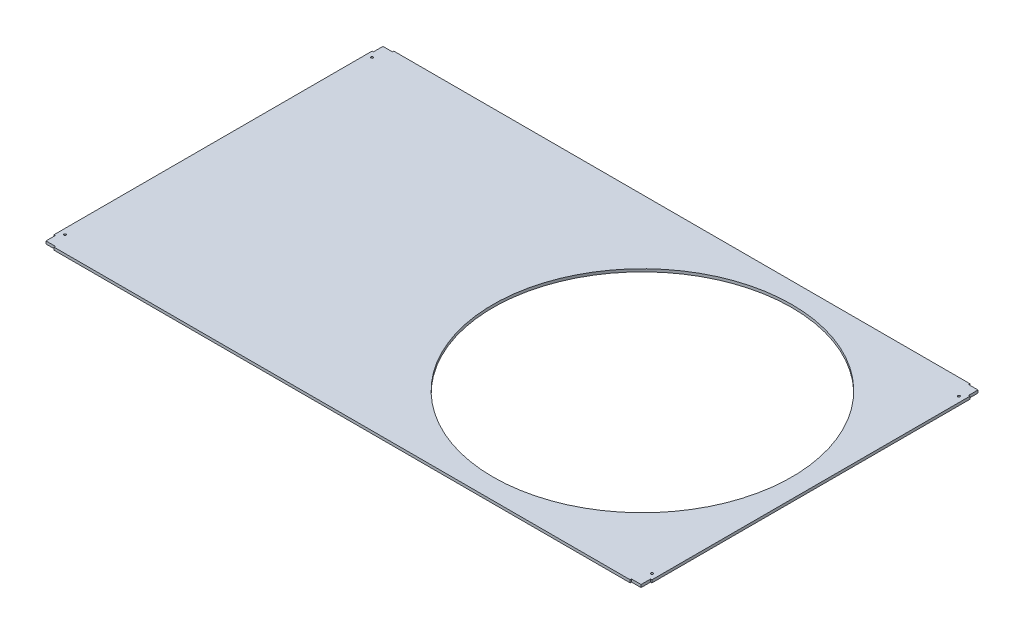
ISO-10303-21;
HEADER;
FILE_DESCRIPTION(('STEP AP214'),'2;1');
FILE_NAME('part.step','',(''),(''),'','','');
FILE_SCHEMA(('AUTOMOTIVE_DESIGN { 1 0 10303 214 1 1 1 1 }'));
ENDSEC;
DATA;
#1=APPLICATION_CONTEXT('core data for automotive mechanical design processes');
#2=APPLICATION_PROTOCOL_DEFINITION('international standard','automotive_design',2000,#1);
#3=PRODUCT_CONTEXT('',#1,'mechanical');
#4=PRODUCT('Part','Part','',(#3));
#5=PRODUCT_RELATED_PRODUCT_CATEGORY('part','',(#4));
#6=PRODUCT_DEFINITION_FORMATION('','',#4);
#7=PRODUCT_DEFINITION_CONTEXT('part definition',#1,'design');
#8=PRODUCT_DEFINITION('design','',#6,#7);
#9=PRODUCT_DEFINITION_SHAPE('','',#8);
#10=(LENGTH_UNIT() NAMED_UNIT(*) SI_UNIT(.MILLI.,.METRE.));
#11=(NAMED_UNIT(*) PLANE_ANGLE_UNIT() SI_UNIT($,.RADIAN.));
#12=(NAMED_UNIT(*) SI_UNIT($,.STERADIAN.) SOLID_ANGLE_UNIT());
#13=UNCERTAINTY_MEASURE_WITH_UNIT(LENGTH_MEASURE(1.E-05),#10,'distance_accuracy_value','');
#14=(GEOMETRIC_REPRESENTATION_CONTEXT(3) GLOBAL_UNCERTAINTY_ASSIGNED_CONTEXT((#13)) GLOBAL_UNIT_ASSIGNED_CONTEXT((#10,
#11,#12)) REPRESENTATION_CONTEXT('',''));
#15=CARTESIAN_POINT('',(0.,0.,0.));
#16=DIRECTION('',(0.,0.,1.));
#17=DIRECTION('',(1.,0.,0.));
#18=AXIS2_PLACEMENT_3D('',#15,#16,#17);
#19=CARTESIAN_POINT('',(0.,10.,0.));
#20=DIRECTION('',(0.,1.,0.));
#21=DIRECTION('',(0.,0.,1.));
#22=AXIS2_PLACEMENT_3D('',#19,#20,#21);
#23=PLANE('',#22);
#24=DIRECTION('',(1.,0.,0.));
#25=VECTOR('',#24,1.);
#26=CARTESIAN_POINT('',(1095.,10.,-585.));
#27=LINE('',#26,#25);
#28=CARTESIAN_POINT('',(1095.,10.,-585.));
#29=VERTEX_POINT('',#28);
#30=CARTESIAN_POINT('',(1100.,10.,-585.));
#31=VERTEX_POINT('',#30);
#32=EDGE_CURVE('E234',#29,#31,#27,.T.);
#33=ORIENTED_EDGE('',*,*,#32,.F.);
#34=DIRECTION('',(0.,0.,1.));
#35=VECTOR('',#34,1.);
#36=CARTESIAN_POINT('',(1095.,10.,-620.));
#37=LINE('',#36,#35);
#38=CARTESIAN_POINT('',(1095.,10.,-620.));
#39=VERTEX_POINT('',#38);
#40=EDGE_CURVE('E378',#39,#29,#37,.T.);
#41=ORIENTED_EDGE('',*,*,#40,.F.);
#42=DIRECTION('',(1.,0.,0.));
#43=VECTOR('',#42,1.);
#44=CARTESIAN_POINT('',(1060.,10.,-620.));
#45=LINE('',#44,#43);
#46=CARTESIAN_POINT('',(1060.,10.,-620.));
#47=VERTEX_POINT('',#46);
#48=EDGE_CURVE('E387',#47,#39,#45,.T.);
#49=ORIENTED_EDGE('',*,*,#48,.F.);
#50=DIRECTION('',(0.,0.,1.));
#51=VECTOR('',#50,1.);
#52=CARTESIAN_POINT('',(1060.,10.,-625.));
#53=LINE('',#52,#51);
#54=CARTESIAN_POINT('',(1060.,10.,-625.));
#55=VERTEX_POINT('',#54);
#56=EDGE_CURVE('E384',#55,#47,#53,.T.);
#57=ORIENTED_EDGE('',*,*,#56,.F.);
#58=DIRECTION('',(-1.,0.,0.));
#59=VECTOR('',#58,1.);
#60=CARTESIAN_POINT('',(-1100.,10.,-625.));
#61=LINE('',#60,#59);
#62=CARTESIAN_POINT('',(-1060.,10.,-625.));
#63=VERTEX_POINT('',#62);
#64=EDGE_CURVE('E11',#55,#63,#61,.T.);
#65=ORIENTED_EDGE('',*,*,#64,.T.);
#66=DIRECTION('',(0.,0.,-1.));
#67=VECTOR('',#66,1.);
#68=CARTESIAN_POINT('',(-1060.,10.,-625.));
#69=LINE('',#68,#67);
#70=CARTESIAN_POINT('',(-1060.,10.,-620.));
#71=VERTEX_POINT('',#70);
#72=EDGE_CURVE('E256',#71,#63,#69,.T.);
#73=ORIENTED_EDGE('',*,*,#72,.F.);
#74=DIRECTION('',(1.,0.,0.));
#75=VECTOR('',#74,1.);
#76=CARTESIAN_POINT('',(-1060.,10.,-620.));
#77=LINE('',#76,#75);
#78=CARTESIAN_POINT('',(-1095.,10.,-620.));
#79=VERTEX_POINT('',#78);
#80=EDGE_CURVE('E272',#79,#71,#77,.T.);
#81=ORIENTED_EDGE('',*,*,#80,.F.);
#82=DIRECTION('',(0.,0.,-1.));
#83=VECTOR('',#82,1.);
#84=CARTESIAN_POINT('',(-1095.,10.,-620.));
#85=LINE('',#84,#83);
#86=CARTESIAN_POINT('',(-1095.,10.,-585.));
#87=VERTEX_POINT('',#86);
#88=EDGE_CURVE('E268',#87,#79,#85,.T.);
#89=ORIENTED_EDGE('',*,*,#88,.F.);
#90=DIRECTION('',(1.,0.,0.));
#91=VECTOR('',#90,1.);
#92=CARTESIAN_POINT('',(-1095.,10.,-585.));
#93=LINE('',#92,#91);
#94=CARTESIAN_POINT('',(-1100.,10.,-585.));
#95=VERTEX_POINT('',#94);
#96=EDGE_CURVE('E265',#95,#87,#93,.T.);
#97=ORIENTED_EDGE('',*,*,#96,.F.);
#98=DIRECTION('',(0.,0.,1.));
#99=VECTOR('',#98,1.);
#100=CARTESIAN_POINT('',(-1100.,10.,-625.));
#101=LINE('',#100,#99);
#102=CARTESIAN_POINT('',(-1100.,10.,585.));
#103=VERTEX_POINT('',#102);
#104=EDGE_CURVE('E216',#95,#103,#101,.T.);
#105=ORIENTED_EDGE('',*,*,#104,.T.);
#106=DIRECTION('',(-1.,0.,0.));
#107=VECTOR('',#106,1.);
#108=CARTESIAN_POINT('',(-1095.,10.,585.));
#109=LINE('',#108,#107);
#110=CARTESIAN_POINT('',(-1095.,10.,585.));
#111=VERTEX_POINT('',#110);
#112=EDGE_CURVE('E180',#111,#103,#109,.T.);
#113=ORIENTED_EDGE('',*,*,#112,.F.);
#114=DIRECTION('',(0.,0.,-1.));
#115=VECTOR('',#114,1.);
#116=CARTESIAN_POINT('',(-1095.,10.,620.));
#117=LINE('',#116,#115);
#118=CARTESIAN_POINT('',(-1095.,10.,620.));
#119=VERTEX_POINT('',#118);
#120=EDGE_CURVE('E197',#119,#111,#117,.T.);
#121=ORIENTED_EDGE('',*,*,#120,.F.);
#122=DIRECTION('',(-1.,0.,0.));
#123=VECTOR('',#122,1.);
#124=CARTESIAN_POINT('',(-1060.,10.,620.));
#125=LINE('',#124,#123);
#126=CARTESIAN_POINT('',(-1060.,10.,620.));
#127=VERTEX_POINT('',#126);
#128=EDGE_CURVE('E598',#127,#119,#125,.T.);
#129=ORIENTED_EDGE('',*,*,#128,.F.);
#130=DIRECTION('',(0.,0.,-1.));
#131=VECTOR('',#130,1.);
#132=CARTESIAN_POINT('',(-1060.,10.,625.));
#133=LINE('',#132,#131);
#134=CARTESIAN_POINT('',(-1060.,10.,625.));
#135=VERTEX_POINT('',#134);
#136=EDGE_CURVE('E594',#135,#127,#133,.T.);
#137=ORIENTED_EDGE('',*,*,#136,.F.);
#138=DIRECTION('',(1.,0.,0.));
#139=VECTOR('',#138,1.);
#140=CARTESIAN_POINT('',(-1100.,10.,625.));
#141=LINE('',#140,#139);
#142=CARTESIAN_POINT('',(1060.,10.,625.));
#143=VERTEX_POINT('',#142);
#144=EDGE_CURVE('E221',#135,#143,#141,.T.);
#145=ORIENTED_EDGE('',*,*,#144,.T.);
#146=DIRECTION('',(0.,0.,1.));
#147=VECTOR('',#146,1.);
#148=CARTESIAN_POINT('',(1060.,10.,625.));
#149=LINE('',#148,#147);
#150=CARTESIAN_POINT('',(1060.,10.,620.));
#151=VERTEX_POINT('',#150);
#152=EDGE_CURVE('E367',#151,#143,#149,.T.);
#153=ORIENTED_EDGE('',*,*,#152,.F.);
#154=DIRECTION('',(-1.,0.,0.));
#155=VECTOR('',#154,1.);
#156=CARTESIAN_POINT('',(1060.,10.,620.));
#157=LINE('',#156,#155);
#158=CARTESIAN_POINT('',(1095.,10.,620.));
#159=VERTEX_POINT('',#158);
#160=EDGE_CURVE('E364',#159,#151,#157,.T.);
#161=ORIENTED_EDGE('',*,*,#160,.F.);
#162=DIRECTION('',(0.,0.,1.));
#163=VECTOR('',#162,1.);
#164=CARTESIAN_POINT('',(1095.,10.,620.));
#165=LINE('',#164,#163);
#166=CARTESIAN_POINT('',(1095.,10.,585.));
#167=VERTEX_POINT('',#166);
#168=EDGE_CURVE('E360',#167,#159,#165,.T.);
#169=ORIENTED_EDGE('',*,*,#168,.F.);
#170=DIRECTION('',(-1.,0.,0.));
#171=VECTOR('',#170,1.);
#172=CARTESIAN_POINT('',(1095.,10.,585.));
#173=LINE('',#172,#171);
#174=CARTESIAN_POINT('',(1100.,10.,585.));
#175=VERTEX_POINT('',#174);
#176=EDGE_CURVE('E237',#175,#167,#173,.T.);
#177=ORIENTED_EDGE('',*,*,#176,.F.);
#178=DIRECTION('',(0.,0.,-1.));
#179=VECTOR('',#178,1.);
#180=CARTESIAN_POINT('',(1100.,10.,-625.));
#181=LINE('',#180,#179);
#182=EDGE_CURVE('E44',#175,#31,#181,.T.);
#183=ORIENTED_EDGE('',*,*,#182,.T.);
#184=EDGE_LOOP('',(#33,#41,#49,#57,#65,#73,#81,#89,#97,#105,#113,#121,#129,#137,#145,#153,#161,
#169,#177,#183));
#185=FACE_BOUND('',#184,.T.);
#186=CARTESIAN_POINT('',(1080.,10.,-565.));
#187=DIRECTION('',(0.,1.,0.));
#188=DIRECTION('',(0.,0.,1.));
#189=AXIS2_PLACEMENT_3D('',#186,#187,#188);
#190=CIRCLE('',#189,4.05000000000015);
#191=CARTESIAN_POINT('',(1080.,10.,-560.95));
#192=VERTEX_POINT('',#191);
#193=EDGE_CURVE('E278',#192,#192,#190,.T.);
#194=ORIENTED_EDGE('',*,*,#193,.F.);
#195=EDGE_LOOP('',(#194));
#196=FACE_BOUND('',#195,.T.);
#197=CARTESIAN_POINT('',(1080.,10.,565.));
#198=DIRECTION('',(0.,1.,0.));
#199=DIRECTION('',(0.,0.,1.));
#200=AXIS2_PLACEMENT_3D('',#197,#198,#199);
#201=CIRCLE('',#200,4.05000000000015);
#202=CARTESIAN_POINT('',(1080.,10.,569.05));
#203=VERTEX_POINT('',#202);
#204=EDGE_CURVE('E296',#203,#203,#201,.T.);
#205=ORIENTED_EDGE('',*,*,#204,.F.);
#206=EDGE_LOOP('',(#205));
#207=FACE_BOUND('',#206,.T.);
#208=CARTESIAN_POINT('',(-1080.,10.,565.));
#209=DIRECTION('',(0.,1.,0.));
#210=DIRECTION('',(0.,0.,1.));
#211=AXIS2_PLACEMENT_3D('',#208,#209,#210);
#212=CIRCLE('',#211,4.05000000000015);
#213=CARTESIAN_POINT('',(-1080.,10.,569.05));
#214=VERTEX_POINT('',#213);
#215=EDGE_CURVE('E290',#214,#214,#212,.T.);
#216=ORIENTED_EDGE('',*,*,#215,.F.);
#217=EDGE_LOOP('',(#216));
#218=FACE_BOUND('',#217,.T.);
#219=CARTESIAN_POINT('',(-1080.,10.,-565.));
#220=DIRECTION('',(0.,1.,0.));
#221=DIRECTION('',(0.,0.,1.));
#222=AXIS2_PLACEMENT_3D('',#219,#220,#221);
#223=CIRCLE('',#222,4.05000000000015);
#224=CARTESIAN_POINT('',(-1080.,10.,-560.95));
#225=VERTEX_POINT('',#224);
#226=EDGE_CURVE('E289',#225,#225,#223,.T.);
#227=ORIENTED_EDGE('',*,*,#226,.F.);
#228=EDGE_LOOP('',(#227));
#229=FACE_BOUND('',#228,.T.);
#230=CARTESIAN_POINT('',(480.,10.,0.));
#231=DIRECTION('',(0.,1.,0.));
#232=DIRECTION('',(0.,0.,1.));
#233=AXIS2_PLACEMENT_3D('',#230,#231,#232);
#234=CIRCLE('',#233,550.);
#235=CARTESIAN_POINT('',(480.,10.,550.));
#236=VERTEX_POINT('',#235);
#237=EDGE_CURVE('E202',#236,#236,#234,.T.);
#238=ORIENTED_EDGE('',*,*,#237,.F.);
#239=EDGE_LOOP('',(#238));
#240=FACE_BOUND('',#239,.T.);
#241=ADVANCED_FACE('F35',(#185,#196,#207,#218,#229,#240),#23,.T.);
#242=CARTESIAN_POINT('',(0.,0.,0.));
#243=DIRECTION('',(0.,1.,0.));
#244=DIRECTION('',(0.,0.,1.));
#245=AXIS2_PLACEMENT_3D('',#242,#243,#244);
#246=PLANE('',#245);
#247=CARTESIAN_POINT('',(1080.,0.,-565.));
#248=DIRECTION('',(0.,1.,0.));
#249=DIRECTION('',(0.,0.,1.));
#250=AXIS2_PLACEMENT_3D('',#247,#248,#249);
#251=CIRCLE('',#250,4.05000000000015);
#252=CARTESIAN_POINT('',(1080.,0.,-560.95));
#253=VERTEX_POINT('',#252);
#254=EDGE_CURVE('E299',#253,#253,#251,.T.);
#255=ORIENTED_EDGE('',*,*,#254,.T.);
#256=EDGE_LOOP('',(#255));
#257=FACE_BOUND('',#256,.T.);
#258=CARTESIAN_POINT('',(1080.,0.,565.));
#259=DIRECTION('',(0.,1.,0.));
#260=DIRECTION('',(0.,0.,1.));
#261=AXIS2_PLACEMENT_3D('',#258,#259,#260);
#262=CIRCLE('',#261,4.05000000000015);
#263=CARTESIAN_POINT('',(1080.,0.,569.05));
#264=VERTEX_POINT('',#263);
#265=EDGE_CURVE('E293',#264,#264,#262,.T.);
#266=ORIENTED_EDGE('',*,*,#265,.T.);
#267=EDGE_LOOP('',(#266));
#268=FACE_BOUND('',#267,.T.);
#269=CARTESIAN_POINT('',(-1080.,0.,565.));
#270=DIRECTION('',(0.,1.,0.));
#271=DIRECTION('',(0.,0.,1.));
#272=AXIS2_PLACEMENT_3D('',#269,#270,#271);
#273=CIRCLE('',#272,4.05000000000015);
#274=CARTESIAN_POINT('',(-1080.,0.,569.05));
#275=VERTEX_POINT('',#274);
#276=EDGE_CURVE('E286',#275,#275,#273,.T.);
#277=ORIENTED_EDGE('',*,*,#276,.T.);
#278=EDGE_LOOP('',(#277));
#279=FACE_BOUND('',#278,.T.);
#280=CARTESIAN_POINT('',(-1080.,0.,-565.));
#281=DIRECTION('',(0.,1.,0.));
#282=DIRECTION('',(0.,0.,1.));
#283=AXIS2_PLACEMENT_3D('',#280,#281,#282);
#284=CIRCLE('',#283,4.05000000000015);
#285=CARTESIAN_POINT('',(-1080.,0.,-560.95));
#286=VERTEX_POINT('',#285);
#287=EDGE_CURVE('E304',#286,#286,#284,.T.);
#288=ORIENTED_EDGE('',*,*,#287,.T.);
#289=EDGE_LOOP('',(#288));
#290=FACE_BOUND('',#289,.T.);
#291=DIRECTION('',(0.,0.,1.));
#292=VECTOR('',#291,1.);
#293=CARTESIAN_POINT('',(1095.,0.,-620.));
#294=LINE('',#293,#292);
#295=CARTESIAN_POINT('',(1095.,0.,-620.));
#296=VERTEX_POINT('',#295);
#297=CARTESIAN_POINT('',(1095.,0.,-585.));
#298=VERTEX_POINT('',#297);
#299=EDGE_CURVE('E245',#296,#298,#294,.T.);
#300=ORIENTED_EDGE('',*,*,#299,.T.);
#301=DIRECTION('',(1.,0.,0.));
#302=VECTOR('',#301,1.);
#303=CARTESIAN_POINT('',(1095.,0.,-585.));
#304=LINE('',#303,#302);
#305=CARTESIAN_POINT('',(1100.,0.,-585.));
#306=VERTEX_POINT('',#305);
#307=EDGE_CURVE('E375',#298,#306,#304,.T.);
#308=ORIENTED_EDGE('',*,*,#307,.T.);
#309=DIRECTION('',(0.,0.,-1.));
#310=VECTOR('',#309,1.);
#311=CARTESIAN_POINT('',(1100.,0.,-625.));
#312=LINE('',#311,#310);
#313=CARTESIAN_POINT('',(1100.,0.,585.));
#314=VERTEX_POINT('',#313);
#315=EDGE_CURVE('E205',#314,#306,#312,.T.);
#316=ORIENTED_EDGE('',*,*,#315,.F.);
#317=DIRECTION('',(-1.,0.,0.));
#318=VECTOR('',#317,1.);
#319=CARTESIAN_POINT('',(1095.,0.,585.));
#320=LINE('',#319,#318);
#321=CARTESIAN_POINT('',(1095.,0.,585.));
#322=VERTEX_POINT('',#321);
#323=EDGE_CURVE('E60',#314,#322,#320,.T.);
#324=ORIENTED_EDGE('',*,*,#323,.T.);
#325=DIRECTION('',(0.,0.,1.));
#326=VECTOR('',#325,1.);
#327=CARTESIAN_POINT('',(1095.,0.,620.));
#328=LINE('',#327,#326);
#329=CARTESIAN_POINT('',(1095.,0.,620.));
#330=VERTEX_POINT('',#329);
#331=EDGE_CURVE('E355',#322,#330,#328,.T.);
#332=ORIENTED_EDGE('',*,*,#331,.T.);
#333=DIRECTION('',(-1.,0.,0.));
#334=VECTOR('',#333,1.);
#335=CARTESIAN_POINT('',(1060.,0.,620.));
#336=LINE('',#335,#334);
#337=CARTESIAN_POINT('',(1060.,0.,620.));
#338=VERTEX_POINT('',#337);
#339=EDGE_CURVE('E350',#330,#338,#336,.T.);
#340=ORIENTED_EDGE('',*,*,#339,.T.);
#341=DIRECTION('',(0.,0.,1.));
#342=VECTOR('',#341,1.);
#343=CARTESIAN_POINT('',(1060.,0.,625.));
#344=LINE('',#343,#342);
#345=CARTESIAN_POINT('',(1060.,0.,625.));
#346=VERTEX_POINT('',#345);
#347=EDGE_CURVE('E347',#338,#346,#344,.T.);
#348=ORIENTED_EDGE('',*,*,#347,.T.);
#349=DIRECTION('',(1.,0.,0.));
#350=VECTOR('',#349,1.);
#351=CARTESIAN_POINT('',(-1100.,0.,625.));
#352=LINE('',#351,#350);
#353=CARTESIAN_POINT('',(-1060.,0.,625.));
#354=VERTEX_POINT('',#353);
#355=EDGE_CURVE('E201',#354,#346,#352,.T.);
#356=ORIENTED_EDGE('',*,*,#355,.F.);
#357=DIRECTION('',(0.,0.,-1.));
#358=VECTOR('',#357,1.);
#359=CARTESIAN_POINT('',(-1060.,0.,625.));
#360=LINE('',#359,#358);
#361=CARTESIAN_POINT('',(-1060.,0.,620.));
#362=VERTEX_POINT('',#361);
#363=EDGE_CURVE('E52',#354,#362,#360,.T.);
#364=ORIENTED_EDGE('',*,*,#363,.T.);
#365=DIRECTION('',(-1.,0.,0.));
#366=VECTOR('',#365,1.);
#367=CARTESIAN_POINT('',(-1060.,0.,620.));
#368=LINE('',#367,#366);
#369=CARTESIAN_POINT('',(-1095.,0.,620.));
#370=VERTEX_POINT('',#369);
#371=EDGE_CURVE('E615',#362,#370,#368,.T.);
#372=ORIENTED_EDGE('',*,*,#371,.T.);
#373=DIRECTION('',(0.,0.,-1.));
#374=VECTOR('',#373,1.);
#375=CARTESIAN_POINT('',(-1095.,0.,620.));
#376=LINE('',#375,#374);
#377=CARTESIAN_POINT('',(-1095.,0.,585.));
#378=VERTEX_POINT('',#377);
#379=EDGE_CURVE('E186',#370,#378,#376,.T.);
#380=ORIENTED_EDGE('',*,*,#379,.T.);
#381=DIRECTION('',(-1.,0.,0.));
#382=VECTOR('',#381,1.);
#383=CARTESIAN_POINT('',(-1095.,0.,585.));
#384=LINE('',#383,#382);
#385=CARTESIAN_POINT('',(-1100.,0.,585.));
#386=VERTEX_POINT('',#385);
#387=EDGE_CURVE('E177',#378,#386,#384,.T.);
#388=ORIENTED_EDGE('',*,*,#387,.T.);
#389=DIRECTION('',(0.,0.,1.));
#390=VECTOR('',#389,1.);
#391=CARTESIAN_POINT('',(-1100.,0.,-625.));
#392=LINE('',#391,#390);
#393=CARTESIAN_POINT('',(-1100.,0.,-585.));
#394=VERTEX_POINT('',#393);
#395=EDGE_CURVE('E194',#394,#386,#392,.T.);
#396=ORIENTED_EDGE('',*,*,#395,.F.);
#397=DIRECTION('',(1.,0.,0.));
#398=VECTOR('',#397,1.);
#399=CARTESIAN_POINT('',(-1095.,0.,-585.));
#400=LINE('',#399,#398);
#401=CARTESIAN_POINT('',(-1095.,0.,-585.));
#402=VERTEX_POINT('',#401);
#403=EDGE_CURVE('E253',#394,#402,#400,.T.);
#404=ORIENTED_EDGE('',*,*,#403,.T.);
#405=DIRECTION('',(0.,0.,-1.));
#406=VECTOR('',#405,1.);
#407=CARTESIAN_POINT('',(-1095.,0.,-620.));
#408=LINE('',#407,#406);
#409=CARTESIAN_POINT('',(-1095.,0.,-620.));
#410=VERTEX_POINT('',#409);
#411=EDGE_CURVE('E255',#402,#410,#408,.T.);
#412=ORIENTED_EDGE('',*,*,#411,.T.);
#413=DIRECTION('',(1.,0.,0.));
#414=VECTOR('',#413,1.);
#415=CARTESIAN_POINT('',(-1060.,0.,-620.));
#416=LINE('',#415,#414);
#417=CARTESIAN_POINT('',(-1060.,0.,-620.));
#418=VERTEX_POINT('',#417);
#419=EDGE_CURVE('E259',#410,#418,#416,.T.);
#420=ORIENTED_EDGE('',*,*,#419,.T.);
#421=DIRECTION('',(0.,0.,-1.));
#422=VECTOR('',#421,1.);
#423=CARTESIAN_POINT('',(-1060.,0.,-625.));
#424=LINE('',#423,#422);
#425=CARTESIAN_POINT('',(-1060.,0.,-625.));
#426=VERTEX_POINT('',#425);
#427=EDGE_CURVE('E262',#418,#426,#424,.T.);
#428=ORIENTED_EDGE('',*,*,#427,.T.);
#429=DIRECTION('',(-1.,0.,0.));
#430=VECTOR('',#429,1.);
#431=CARTESIAN_POINT('',(-1100.,0.,-625.));
#432=LINE('',#431,#430);
#433=CARTESIAN_POINT('',(1060.,0.,-625.));
#434=VERTEX_POINT('',#433);
#435=EDGE_CURVE('E39',#434,#426,#432,.T.);
#436=ORIENTED_EDGE('',*,*,#435,.F.);
#437=DIRECTION('',(0.,0.,1.));
#438=VECTOR('',#437,1.);
#439=CARTESIAN_POINT('',(1060.,0.,-625.));
#440=LINE('',#439,#438);
#441=CARTESIAN_POINT('',(1060.,0.,-620.));
#442=VERTEX_POINT('',#441);
#443=EDGE_CURVE('E377',#434,#442,#440,.T.);
#444=ORIENTED_EDGE('',*,*,#443,.T.);
#445=DIRECTION('',(1.,0.,0.));
#446=VECTOR('',#445,1.);
#447=CARTESIAN_POINT('',(1060.,0.,-620.));
#448=LINE('',#447,#446);
#449=EDGE_CURVE('E249',#442,#296,#448,.T.);
#450=ORIENTED_EDGE('',*,*,#449,.T.);
#451=EDGE_LOOP('',(#300,#308,#316,#324,#332,#340,#348,#356,#364,#372,#380,#388,#396,#404,#412,
#420,#428,#436,#444,#450));
#452=FACE_BOUND('',#451,.T.);
#453=CARTESIAN_POINT('',(480.,0.,0.));
#454=DIRECTION('',(0.,1.,0.));
#455=DIRECTION('',(0.,0.,1.));
#456=AXIS2_PLACEMENT_3D('',#453,#454,#455);
#457=CIRCLE('',#456,550.);
#458=CARTESIAN_POINT('',(480.,0.,550.));
#459=VERTEX_POINT('',#458);
#460=EDGE_CURVE('E208',#459,#459,#457,.T.);
#461=ORIENTED_EDGE('',*,*,#460,.T.);
#462=EDGE_LOOP('',(#461));
#463=FACE_BOUND('',#462,.T.);
#464=ADVANCED_FACE('F191',(#257,#268,#279,#290,#452,#463),#246,.F.);
#465=CARTESIAN_POINT('',(-1100.,10.,-625.));
#466=DIRECTION('',(1.,0.,0.));
#467=DIRECTION('',(0.,0.,-1.));
#468=AXIS2_PLACEMENT_3D('',#465,#466,#467);
#469=PLANE('',#468);
#470=ORIENTED_EDGE('',*,*,#395,.T.);
#471=DIRECTION('',(0.,1.,0.));
#472=VECTOR('',#471,1.);
#473=CARTESIAN_POINT('',(-1100.,0.,585.));
#474=LINE('',#473,#472);
#475=EDGE_CURVE('E174',#386,#103,#474,.T.);
#476=ORIENTED_EDGE('',*,*,#475,.T.);
#477=ORIENTED_EDGE('',*,*,#104,.F.);
#478=DIRECTION('',(0.,1.,0.));
#479=VECTOR('',#478,1.);
#480=CARTESIAN_POINT('',(-1100.,0.,-585.));
#481=LINE('',#480,#479);
#482=EDGE_CURVE('E200',#394,#95,#481,.T.);
#483=ORIENTED_EDGE('',*,*,#482,.F.);
#484=EDGE_LOOP('',(#470,#476,#477,#483));
#485=FACE_BOUND('',#484,.T.);
#486=ADVANCED_FACE('F37',(#485),#469,.F.);
#487=CARTESIAN_POINT('',(-1100.,10.,625.));
#488=DIRECTION('',(0.,0.,-1.));
#489=DIRECTION('',(-1.,0.,0.));
#490=AXIS2_PLACEMENT_3D('',#487,#488,#489);
#491=PLANE('',#490);
#492=ORIENTED_EDGE('',*,*,#355,.T.);
#493=DIRECTION('',(0.,1.,0.));
#494=VECTOR('',#493,1.);
#495=CARTESIAN_POINT('',(1060.,0.,625.));
#496=LINE('',#495,#494);
#497=EDGE_CURVE('E343',#346,#143,#496,.T.);
#498=ORIENTED_EDGE('',*,*,#497,.T.);
#499=ORIENTED_EDGE('',*,*,#144,.F.);
#500=DIRECTION('',(0.,1.,0.));
#501=VECTOR('',#500,1.);
#502=CARTESIAN_POINT('',(-1060.,0.,625.));
#503=LINE('',#502,#501);
#504=EDGE_CURVE('E185',#354,#135,#503,.T.);
#505=ORIENTED_EDGE('',*,*,#504,.F.);
#506=EDGE_LOOP('',(#492,#498,#499,#505));
#507=FACE_BOUND('',#506,.T.);
#508=ADVANCED_FACE('F330',(#507),#491,.F.);
#509=CARTESIAN_POINT('',(1100.,10.,-625.));
#510=DIRECTION('',(-1.,0.,0.));
#511=DIRECTION('',(0.,0.,1.));
#512=AXIS2_PLACEMENT_3D('',#509,#510,#511);
#513=PLANE('',#512);
#514=ORIENTED_EDGE('',*,*,#315,.T.);
#515=DIRECTION('',(0.,1.,0.));
#516=VECTOR('',#515,1.);
#517=CARTESIAN_POINT('',(1100.,0.,-585.));
#518=LINE('',#517,#516);
#519=EDGE_CURVE('E240',#306,#31,#518,.T.);
#520=ORIENTED_EDGE('',*,*,#519,.T.);
#521=ORIENTED_EDGE('',*,*,#182,.F.);
#522=DIRECTION('',(0.,1.,0.));
#523=VECTOR('',#522,1.);
#524=CARTESIAN_POINT('',(1100.,0.,585.));
#525=LINE('',#524,#523);
#526=EDGE_CURVE('E239',#314,#175,#525,.T.);
#527=ORIENTED_EDGE('',*,*,#526,.F.);
#528=EDGE_LOOP('',(#514,#520,#521,#527));
#529=FACE_BOUND('',#528,.T.);
#530=ADVANCED_FACE('F238',(#529),#513,.F.);
#531=CARTESIAN_POINT('',(-1100.,10.,-625.));
#532=DIRECTION('',(0.,0.,1.));
#533=DIRECTION('',(1.,0.,0.));
#534=AXIS2_PLACEMENT_3D('',#531,#532,#533);
#535=PLANE('',#534);
#536=ORIENTED_EDGE('',*,*,#64,.F.);
#537=DIRECTION('',(0.,1.,0.));
#538=VECTOR('',#537,1.);
#539=CARTESIAN_POINT('',(1060.,0.,-625.));
#540=LINE('',#539,#538);
#541=EDGE_CURVE('E244',#434,#55,#540,.T.);
#542=ORIENTED_EDGE('',*,*,#541,.F.);
#543=ORIENTED_EDGE('',*,*,#435,.T.);
#544=DIRECTION('',(0.,1.,0.));
#545=VECTOR('',#544,1.);
#546=CARTESIAN_POINT('',(-1060.,0.,-625.));
#547=LINE('',#546,#545);
#548=EDGE_CURVE('E276',#426,#63,#547,.T.);
#549=ORIENTED_EDGE('',*,*,#548,.T.);
#550=EDGE_LOOP('',(#536,#542,#543,#549));
#551=FACE_BOUND('',#550,.T.);
#552=ADVANCED_FACE('F320',(#551),#535,.F.);
#553=CARTESIAN_POINT('',(480.,10.,0.));
#554=DIRECTION('',(0.,-1.,0.));
#555=DIRECTION('',(0.,0.,-1.));
#556=AXIS2_PLACEMENT_3D('',#553,#554,#555);
#557=CYLINDRICAL_SURFACE('',#556,550.);
#558=ORIENTED_EDGE('',*,*,#237,.T.);
#559=EDGE_LOOP('',(#558));
#560=FACE_BOUND('',#559,.T.);
#561=ORIENTED_EDGE('',*,*,#460,.F.);
#562=EDGE_LOOP('',(#561));
#563=FACE_BOUND('',#562,.T.);
#564=ADVANCED_FACE('F317',(#560,#563),#557,.F.);
#565=CARTESIAN_POINT('',(-1080.,0.,-565.));
#566=DIRECTION('',(0.,1.,0.));
#567=DIRECTION('',(0.,0.,1.));
#568=AXIS2_PLACEMENT_3D('',#565,#566,#567);
#569=CYLINDRICAL_SURFACE('',#568,4.05000000000015);
#570=ORIENTED_EDGE('',*,*,#287,.F.);
#571=EDGE_LOOP('',(#570));
#572=FACE_BOUND('',#571,.T.);
#573=ORIENTED_EDGE('',*,*,#226,.T.);
#574=EDGE_LOOP('',(#573));
#575=FACE_BOUND('',#574,.T.);
#576=ADVANCED_FACE('F310',(#572,#575),#569,.F.);
#577=CARTESIAN_POINT('',(-1080.,0.,565.));
#578=DIRECTION('',(0.,1.,0.));
#579=DIRECTION('',(0.,0.,1.));
#580=AXIS2_PLACEMENT_3D('',#577,#578,#579);
#581=CYLINDRICAL_SURFACE('',#580,4.05000000000015);
#582=ORIENTED_EDGE('',*,*,#276,.F.);
#583=EDGE_LOOP('',(#582));
#584=FACE_BOUND('',#583,.T.);
#585=ORIENTED_EDGE('',*,*,#215,.T.);
#586=EDGE_LOOP('',(#585));
#587=FACE_BOUND('',#586,.T.);
#588=ADVANCED_FACE('F430',(#584,#587),#581,.F.);
#589=CARTESIAN_POINT('',(1080.,0.,565.));
#590=DIRECTION('',(0.,1.,0.));
#591=DIRECTION('',(0.,0.,1.));
#592=AXIS2_PLACEMENT_3D('',#589,#590,#591);
#593=CYLINDRICAL_SURFACE('',#592,4.05000000000015);
#594=ORIENTED_EDGE('',*,*,#265,.F.);
#595=EDGE_LOOP('',(#594));
#596=FACE_BOUND('',#595,.T.);
#597=ORIENTED_EDGE('',*,*,#204,.T.);
#598=EDGE_LOOP('',(#597));
#599=FACE_BOUND('',#598,.T.);
#600=ADVANCED_FACE('F433',(#596,#599),#593,.F.);
#601=CARTESIAN_POINT('',(1080.,0.,-565.));
#602=DIRECTION('',(0.,1.,0.));
#603=DIRECTION('',(0.,0.,1.));
#604=AXIS2_PLACEMENT_3D('',#601,#602,#603);
#605=CYLINDRICAL_SURFACE('',#604,4.05000000000015);
#606=ORIENTED_EDGE('',*,*,#254,.F.);
#607=EDGE_LOOP('',(#606));
#608=FACE_BOUND('',#607,.T.);
#609=ORIENTED_EDGE('',*,*,#193,.T.);
#610=EDGE_LOOP('',(#609));
#611=FACE_BOUND('',#610,.T.);
#612=ADVANCED_FACE('F437',(#608,#611),#605,.F.);
#613=CARTESIAN_POINT('',(-1060.,0.,-625.));
#614=DIRECTION('',(1.,0.,0.));
#615=DIRECTION('',(0.,0.,-1.));
#616=AXIS2_PLACEMENT_3D('',#613,#614,#615);
#617=PLANE('',#616);
#618=ORIENTED_EDGE('',*,*,#72,.T.);
#619=ORIENTED_EDGE('',*,*,#548,.F.);
#620=ORIENTED_EDGE('',*,*,#427,.F.);
#621=DIRECTION('',(0.,1.,0.));
#622=VECTOR('',#621,1.);
#623=CARTESIAN_POINT('',(-1060.,0.,-620.));
#624=LINE('',#623,#622);
#625=EDGE_CURVE('E279',#418,#71,#624,.T.);
#626=ORIENTED_EDGE('',*,*,#625,.T.);
#627=EDGE_LOOP('',(#618,#619,#620,#626));
#628=FACE_BOUND('',#627,.T.);
#629=ADVANCED_FACE('F409',(#628),#617,.F.);
#630=CARTESIAN_POINT('',(-1060.,0.,-620.));
#631=DIRECTION('',(0.,0.,1.));
#632=DIRECTION('',(1.,0.,0.));
#633=AXIS2_PLACEMENT_3D('',#630,#631,#632);
#634=PLANE('',#633);
#635=ORIENTED_EDGE('',*,*,#80,.T.);
#636=ORIENTED_EDGE('',*,*,#625,.F.);
#637=ORIENTED_EDGE('',*,*,#419,.F.);
#638=DIRECTION('',(0.,1.,0.));
#639=VECTOR('',#638,1.);
#640=CARTESIAN_POINT('',(-1095.,0.,-620.));
#641=LINE('',#640,#639);
#642=EDGE_CURVE('E281',#410,#79,#641,.T.);
#643=ORIENTED_EDGE('',*,*,#642,.T.);
#644=EDGE_LOOP('',(#635,#636,#637,#643));
#645=FACE_BOUND('',#644,.T.);
#646=ADVANCED_FACE('F413',(#645),#634,.F.);
#647=CARTESIAN_POINT('',(-1095.,0.,-620.));
#648=DIRECTION('',(1.,0.,0.));
#649=DIRECTION('',(0.,0.,-1.));
#650=AXIS2_PLACEMENT_3D('',#647,#648,#649);
#651=PLANE('',#650);
#652=ORIENTED_EDGE('',*,*,#88,.T.);
#653=ORIENTED_EDGE('',*,*,#642,.F.);
#654=ORIENTED_EDGE('',*,*,#411,.F.);
#655=DIRECTION('',(0.,1.,0.));
#656=VECTOR('',#655,1.);
#657=CARTESIAN_POINT('',(-1095.,0.,-585.));
#658=LINE('',#657,#656);
#659=EDGE_CURVE('E283',#402,#87,#658,.T.);
#660=ORIENTED_EDGE('',*,*,#659,.T.);
#661=EDGE_LOOP('',(#652,#653,#654,#660));
#662=FACE_BOUND('',#661,.T.);
#663=ADVANCED_FACE('F416',(#662),#651,.F.);
#664=CARTESIAN_POINT('',(-1095.,0.,-585.));
#665=DIRECTION('',(0.,0.,1.));
#666=DIRECTION('',(1.,0.,0.));
#667=AXIS2_PLACEMENT_3D('',#664,#665,#666);
#668=PLANE('',#667);
#669=ORIENTED_EDGE('',*,*,#96,.T.);
#670=ORIENTED_EDGE('',*,*,#659,.F.);
#671=ORIENTED_EDGE('',*,*,#403,.F.);
#672=ORIENTED_EDGE('',*,*,#482,.T.);
#673=EDGE_LOOP('',(#669,#670,#671,#672));
#674=FACE_BOUND('',#673,.T.);
#675=ADVANCED_FACE('F418',(#674),#668,.F.);
#676=CARTESIAN_POINT('',(1095.,0.,-585.));
#677=DIRECTION('',(0.,0.,1.));
#678=DIRECTION('',(1.,0.,0.));
#679=AXIS2_PLACEMENT_3D('',#676,#677,#678);
#680=PLANE('',#679);
#681=ORIENTED_EDGE('',*,*,#32,.T.);
#682=ORIENTED_EDGE('',*,*,#519,.F.);
#683=ORIENTED_EDGE('',*,*,#307,.F.);
#684=DIRECTION('',(0.,1.,0.));
#685=VECTOR('',#684,1.);
#686=CARTESIAN_POINT('',(1095.,0.,-585.));
#687=LINE('',#686,#685);
#688=EDGE_CURVE('E361',#298,#29,#687,.T.);
#689=ORIENTED_EDGE('',*,*,#688,.T.);
#690=EDGE_LOOP('',(#681,#682,#683,#689));
#691=FACE_BOUND('',#690,.T.);
#692=ADVANCED_FACE('F420',(#691),#680,.F.);
#693=CARTESIAN_POINT('',(1095.,0.,-620.));
#694=DIRECTION('',(-1.,0.,0.));
#695=DIRECTION('',(0.,0.,1.));
#696=AXIS2_PLACEMENT_3D('',#693,#694,#695);
#697=PLANE('',#696);
#698=ORIENTED_EDGE('',*,*,#40,.T.);
#699=ORIENTED_EDGE('',*,*,#688,.F.);
#700=ORIENTED_EDGE('',*,*,#299,.F.);
#701=DIRECTION('',(0.,1.,0.));
#702=VECTOR('',#701,1.);
#703=CARTESIAN_POINT('',(1095.,0.,-620.));
#704=LINE('',#703,#702);
#705=EDGE_CURVE('E393',#296,#39,#704,.T.);
#706=ORIENTED_EDGE('',*,*,#705,.T.);
#707=EDGE_LOOP('',(#698,#699,#700,#706));
#708=FACE_BOUND('',#707,.T.);
#709=ADVANCED_FACE('F403',(#708),#697,.F.);
#710=CARTESIAN_POINT('',(1060.,0.,-620.));
#711=DIRECTION('',(0.,0.,1.));
#712=DIRECTION('',(1.,0.,0.));
#713=AXIS2_PLACEMENT_3D('',#710,#711,#712);
#714=PLANE('',#713);
#715=ORIENTED_EDGE('',*,*,#48,.T.);
#716=ORIENTED_EDGE('',*,*,#705,.F.);
#717=ORIENTED_EDGE('',*,*,#449,.F.);
#718=DIRECTION('',(0.,1.,0.));
#719=VECTOR('',#718,1.);
#720=CARTESIAN_POINT('',(1060.,0.,-620.));
#721=LINE('',#720,#719);
#722=EDGE_CURVE('E247',#442,#47,#721,.T.);
#723=ORIENTED_EDGE('',*,*,#722,.T.);
#724=EDGE_LOOP('',(#715,#716,#717,#723));
#725=FACE_BOUND('',#724,.T.);
#726=ADVANCED_FACE('F396',(#725),#714,.F.);
#727=CARTESIAN_POINT('',(1060.,0.,-625.));
#728=DIRECTION('',(-1.,0.,0.));
#729=DIRECTION('',(0.,0.,1.));
#730=AXIS2_PLACEMENT_3D('',#727,#728,#729);
#731=PLANE('',#730);
#732=ORIENTED_EDGE('',*,*,#56,.T.);
#733=ORIENTED_EDGE('',*,*,#722,.F.);
#734=ORIENTED_EDGE('',*,*,#443,.F.);
#735=ORIENTED_EDGE('',*,*,#541,.T.);
#736=EDGE_LOOP('',(#732,#733,#734,#735));
#737=FACE_BOUND('',#736,.T.);
#738=ADVANCED_FACE('F400',(#737),#731,.F.);
#739=CARTESIAN_POINT('',(1060.,0.,625.));
#740=DIRECTION('',(-1.,0.,0.));
#741=DIRECTION('',(0.,0.,1.));
#742=AXIS2_PLACEMENT_3D('',#739,#740,#741);
#743=PLANE('',#742);
#744=ORIENTED_EDGE('',*,*,#152,.T.);
#745=ORIENTED_EDGE('',*,*,#497,.F.);
#746=ORIENTED_EDGE('',*,*,#347,.F.);
#747=DIRECTION('',(0.,1.,0.));
#748=VECTOR('',#747,1.);
#749=CARTESIAN_POINT('',(1060.,0.,620.));
#750=LINE('',#749,#748);
#751=EDGE_CURVE('E370',#338,#151,#750,.T.);
#752=ORIENTED_EDGE('',*,*,#751,.T.);
#753=EDGE_LOOP('',(#744,#745,#746,#752));
#754=FACE_BOUND('',#753,.T.);
#755=ADVANCED_FACE('F514',(#754),#743,.F.);
#756=CARTESIAN_POINT('',(1060.,0.,620.));
#757=DIRECTION('',(0.,0.,-1.));
#758=DIRECTION('',(-1.,0.,0.));
#759=AXIS2_PLACEMENT_3D('',#756,#757,#758);
#760=PLANE('',#759);
#761=ORIENTED_EDGE('',*,*,#160,.T.);
#762=ORIENTED_EDGE('',*,*,#751,.F.);
#763=ORIENTED_EDGE('',*,*,#339,.F.);
#764=DIRECTION('',(0.,1.,0.));
#765=VECTOR('',#764,1.);
#766=CARTESIAN_POINT('',(1095.,0.,620.));
#767=LINE('',#766,#765);
#768=EDGE_CURVE('E372',#330,#159,#767,.T.);
#769=ORIENTED_EDGE('',*,*,#768,.T.);
#770=EDGE_LOOP('',(#761,#762,#763,#769));
#771=FACE_BOUND('',#770,.T.);
#772=ADVANCED_FACE('F523',(#771),#760,.F.);
#773=CARTESIAN_POINT('',(1095.,0.,620.));
#774=DIRECTION('',(-1.,0.,0.));
#775=DIRECTION('',(0.,0.,1.));
#776=AXIS2_PLACEMENT_3D('',#773,#774,#775);
#777=PLANE('',#776);
#778=ORIENTED_EDGE('',*,*,#168,.T.);
#779=ORIENTED_EDGE('',*,*,#768,.F.);
#780=ORIENTED_EDGE('',*,*,#331,.F.);
#781=DIRECTION('',(0.,1.,0.));
#782=VECTOR('',#781,1.);
#783=CARTESIAN_POINT('',(1095.,0.,585.));
#784=LINE('',#783,#782);
#785=EDGE_CURVE('E353',#322,#167,#784,.T.);
#786=ORIENTED_EDGE('',*,*,#785,.T.);
#787=EDGE_LOOP('',(#778,#779,#780,#786));
#788=FACE_BOUND('',#787,.T.);
#789=ADVANCED_FACE('F532',(#788),#777,.F.);
#790=CARTESIAN_POINT('',(1095.,0.,585.));
#791=DIRECTION('',(0.,0.,-1.));
#792=DIRECTION('',(-1.,0.,0.));
#793=AXIS2_PLACEMENT_3D('',#790,#791,#792);
#794=PLANE('',#793);
#795=ORIENTED_EDGE('',*,*,#176,.T.);
#796=ORIENTED_EDGE('',*,*,#785,.F.);
#797=ORIENTED_EDGE('',*,*,#323,.F.);
#798=ORIENTED_EDGE('',*,*,#526,.T.);
#799=EDGE_LOOP('',(#795,#796,#797,#798));
#800=FACE_BOUND('',#799,.T.);
#801=ADVANCED_FACE('F542',(#800),#794,.F.);
#802=CARTESIAN_POINT('',(-1095.,0.,585.));
#803=DIRECTION('',(0.,0.,-1.));
#804=DIRECTION('',(-1.,0.,0.));
#805=AXIS2_PLACEMENT_3D('',#802,#803,#804);
#806=PLANE('',#805);
#807=ORIENTED_EDGE('',*,*,#112,.T.);
#808=ORIENTED_EDGE('',*,*,#475,.F.);
#809=ORIENTED_EDGE('',*,*,#387,.F.);
#810=DIRECTION('',(0.,1.,0.));
#811=VECTOR('',#810,1.);
#812=CARTESIAN_POINT('',(-1095.,0.,585.));
#813=LINE('',#812,#811);
#814=EDGE_CURVE('E269',#378,#111,#813,.T.);
#815=ORIENTED_EDGE('',*,*,#814,.T.);
#816=EDGE_LOOP('',(#807,#808,#809,#815));
#817=FACE_BOUND('',#816,.T.);
#818=ADVANCED_FACE('F176',(#817),#806,.F.);
#819=CARTESIAN_POINT('',(-1095.,0.,620.));
#820=DIRECTION('',(1.,0.,0.));
#821=DIRECTION('',(0.,0.,-1.));
#822=AXIS2_PLACEMENT_3D('',#819,#820,#821);
#823=PLANE('',#822);
#824=ORIENTED_EDGE('',*,*,#120,.T.);
#825=ORIENTED_EDGE('',*,*,#814,.F.);
#826=ORIENTED_EDGE('',*,*,#379,.F.);
#827=DIRECTION('',(0.,1.,0.));
#828=VECTOR('',#827,1.);
#829=CARTESIAN_POINT('',(-1095.,0.,620.));
#830=LINE('',#829,#828);
#831=EDGE_CURVE('E608',#370,#119,#830,.T.);
#832=ORIENTED_EDGE('',*,*,#831,.T.);
#833=EDGE_LOOP('',(#824,#825,#826,#832));
#834=FACE_BOUND('',#833,.T.);
#835=ADVANCED_FACE('F560',(#834),#823,.F.);
#836=CARTESIAN_POINT('',(-1060.,0.,620.));
#837=DIRECTION('',(0.,0.,-1.));
#838=DIRECTION('',(-1.,0.,0.));
#839=AXIS2_PLACEMENT_3D('',#836,#837,#838);
#840=PLANE('',#839);
#841=ORIENTED_EDGE('',*,*,#128,.T.);
#842=ORIENTED_EDGE('',*,*,#831,.F.);
#843=ORIENTED_EDGE('',*,*,#371,.F.);
#844=DIRECTION('',(0.,1.,0.));
#845=VECTOR('',#844,1.);
#846=CARTESIAN_POINT('',(-1060.,0.,620.));
#847=LINE('',#846,#845);
#848=EDGE_CURVE('E596',#362,#127,#847,.T.);
#849=ORIENTED_EDGE('',*,*,#848,.T.);
#850=EDGE_LOOP('',(#841,#842,#843,#849));
#851=FACE_BOUND('',#850,.T.);
#852=ADVANCED_FACE('F569',(#851),#840,.F.);
#853=CARTESIAN_POINT('',(-1060.,0.,625.));
#854=DIRECTION('',(1.,0.,0.));
#855=DIRECTION('',(0.,0.,-1.));
#856=AXIS2_PLACEMENT_3D('',#853,#854,#855);
#857=PLANE('',#856);
#858=ORIENTED_EDGE('',*,*,#136,.T.);
#859=ORIENTED_EDGE('',*,*,#848,.F.);
#860=ORIENTED_EDGE('',*,*,#363,.F.);
#861=ORIENTED_EDGE('',*,*,#504,.T.);
#862=EDGE_LOOP('',(#858,#859,#860,#861));
#863=FACE_BOUND('',#862,.T.);
#864=ADVANCED_FACE('F579',(#863),#857,.F.);
#865=CLOSED_SHELL('',(#241,#464,#486,#508,#530,#552,#564,#576,#588,#600,#612,#629,#646,#663,
#675,#692,#709,#726,#738,#755,#772,#789,#801,#818,#835,#852,#864));
#866=MANIFOLD_SOLID_BREP('B2',#865);
#867=ADVANCED_BREP_SHAPE_REPRESENTATION('',(#18,#866),#14);
#868=SHAPE_DEFINITION_REPRESENTATION(#9,#867);
ENDSEC;
END-ISO-10303-21;
